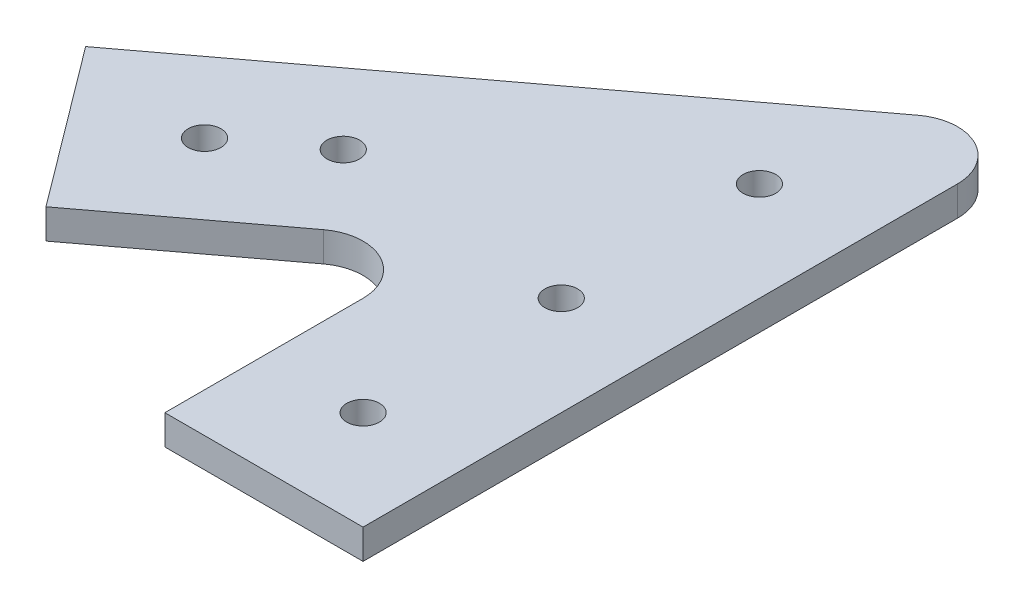
ISO-10303-21;
HEADER;
FILE_DESCRIPTION(('STEP AP214'),'2;1');
FILE_NAME('part.step','',(''),(''),'','','');
FILE_SCHEMA(('AUTOMOTIVE_DESIGN { 1 0 10303 214 1 1 1 1 }'));
ENDSEC;
DATA;
#1=APPLICATION_CONTEXT('core data for automotive mechanical design processes');
#2=APPLICATION_PROTOCOL_DEFINITION('international standard','automotive_design',2000,#1);
#3=PRODUCT_CONTEXT('',#1,'mechanical');
#4=PRODUCT('Part','Part','',(#3));
#5=PRODUCT_RELATED_PRODUCT_CATEGORY('part','',(#4));
#6=PRODUCT_DEFINITION_FORMATION('','',#4);
#7=PRODUCT_DEFINITION_CONTEXT('part definition',#1,'design');
#8=PRODUCT_DEFINITION('design','',#6,#7);
#9=PRODUCT_DEFINITION_SHAPE('','',#8);
#10=(LENGTH_UNIT() NAMED_UNIT(*) SI_UNIT(.MILLI.,.METRE.));
#11=(NAMED_UNIT(*) PLANE_ANGLE_UNIT() SI_UNIT($,.RADIAN.));
#12=(NAMED_UNIT(*) SI_UNIT($,.STERADIAN.) SOLID_ANGLE_UNIT());
#13=UNCERTAINTY_MEASURE_WITH_UNIT(LENGTH_MEASURE(1.E-05),#10,'distance_accuracy_value','');
#14=(GEOMETRIC_REPRESENTATION_CONTEXT(3) GLOBAL_UNCERTAINTY_ASSIGNED_CONTEXT((#13)) GLOBAL_UNIT_ASSIGNED_CONTEXT((#10,
#11,#12)) REPRESENTATION_CONTEXT('',''));
#15=CARTESIAN_POINT('',(0.,0.,0.));
#16=DIRECTION('',(0.,0.,1.));
#17=DIRECTION('',(1.,0.,0.));
#18=AXIS2_PLACEMENT_3D('',#15,#16,#17);
#19=CARTESIAN_POINT('',(0.,3.,0.));
#20=DIRECTION('',(0.,-1.,0.));
#21=DIRECTION('',(0.,0.,-1.));
#22=AXIS2_PLACEMENT_3D('',#19,#20,#21);
#23=PLANE('',#22);
#24=DIRECTION('',(6.39395257904201E-06,0.,-0.999999999979559));
#25=VECTOR('',#24,1.);
#26=CARTESIAN_POINT('',(27.6644898553289,3.,-35.3329838450773));
#27=LINE('',#26,#25);
#28=CARTESIAN_POINT('',(27.6640422930274,3.,34.6647672955904));
#29=VERTEX_POINT('',#28);
#30=CARTESIAN_POINT('',(27.6644259152837,3.,-25.3329026178744));
#31=VERTEX_POINT('',#30);
#32=EDGE_CURVE('E125',#29,#31,#27,.T.);
#33=ORIENTED_EDGE('',*,*,#32,.T.);
#34=CARTESIAN_POINT('',(22.6644259153859,3.,-25.3329345876373));
#35=DIRECTION('',(0.,-1.,0.));
#36=DIRECTION('',(0.,0.,-1.));
#37=AXIS2_PLACEMENT_3D('',#34,#35,#36);
#38=CIRCLE('',#37,5.);
#39=CARTESIAN_POINT('',(19.6644254985948,3.,-29.332934275044));
#40=VERTEX_POINT('',#39);
#41=EDGE_CURVE('E11',#31,#40,#38,.F.);
#42=ORIENTED_EDGE('',*,*,#41,.T.);
#43=DIRECTION('',(-0.79999993748133,0.,0.600000083358218));
#44=VECTOR('',#43,1.);
#45=CARTESIAN_POINT('',(-4.3327082499629,3.,-11.3350800566754));
#46=LINE('',#45,#44);
#47=CARTESIAN_POINT('',(-28.3327064048156,3.,6.66492246688072));
#48=VERTEX_POINT('',#47);
#49=EDGE_CURVE('E153',#40,#48,#46,.T.);
#50=ORIENTED_EDGE('',*,*,#49,.T.);
#51=DIRECTION('',(0.600000083358218,0.,0.79999993748133));
#52=VECTOR('',#51,1.);
#53=CARTESIAN_POINT('',(-28.3327064048156,3.,6.66492246688072));
#54=LINE('',#53,#52);
#55=CARTESIAN_POINT('',(-16.3327047547583,3.,22.6649211936978));
#56=VERTEX_POINT('',#55);
#57=EDGE_CURVE('E177',#48,#56,#54,.T.);
#58=ORIENTED_EDGE('',*,*,#57,.T.);
#59=DIRECTION('',(0.79999993748133,0.,-0.600000083358218));
#60=VECTOR('',#59,1.);
#61=CARTESIAN_POINT('',(-16.3327047547583,3.,22.6649211936978));
#62=LINE('',#61,#60);
#63=CARTESIAN_POINT('',(-0.333790882797412,3.,10.6657331849593));
#64=VERTEX_POINT('',#63);
#65=EDGE_CURVE('E172',#56,#64,#62,.T.);
#66=ORIENTED_EDGE('',*,*,#65,.T.);
#67=CARTESIAN_POINT('',(2.66620953399368,3.,14.665732872366));
#68=DIRECTION('',(0.,-1.,0.));
#69=DIRECTION('',(0.,0.,-1.));
#70=AXIS2_PLACEMENT_3D('',#67,#68,#69);
#71=CIRCLE('',#70,5.);
#72=CARTESIAN_POINT('',(7.6662095046342,3.,14.666274716206));
#73=VERTEX_POINT('',#72);
#74=EDGE_CURVE('E112',#64,#73,#71,.T.);
#75=ORIENTED_EDGE('',*,*,#74,.T.);
#76=DIRECTION('',(-0.000108368768007921,0.,0.999999994128105));
#77=VECTOR('',#76,1.);
#78=CARTESIAN_POINT('',(7.66404229261863,3.,34.6647672955904));
#79=LINE('',#78,#77);
#80=CARTESIAN_POINT('',(7.66404229261863,3.,34.6647672955904));
#81=VERTEX_POINT('',#80);
#82=EDGE_CURVE('E105',#73,#81,#79,.T.);
#83=ORIENTED_EDGE('',*,*,#82,.T.);
#84=DIRECTION('',(1.,0.,0.));
#85=VECTOR('',#84,1.);
#86=CARTESIAN_POINT('',(7.66404229261863,3.,34.6647672955904));
#87=LINE('',#86,#85);
#88=EDGE_CURVE('E108',#81,#29,#87,.T.);
#89=ORIENTED_EDGE('',*,*,#88,.T.);
#90=EDGE_LOOP('',(#33,#42,#50,#58,#66,#75,#83,#89));
#91=FACE_BOUND('',#90,.T.);
#92=CARTESIAN_POINT('',(17.6674917477853,3.,-15.3352327044096));
#93=DIRECTION('',(0.,1.,0.));
#94=DIRECTION('',(0.,0.,1.));
#95=AXIS2_PLACEMENT_3D('',#92,#93,#94);
#96=CIRCLE('',#95,1.64999999221491);
#97=CARTESIAN_POINT('',(17.6674917477853,3.,-13.6852327121947));
#98=VERTEX_POINT('',#97);
#99=EDGE_CURVE('E184',#98,#98,#96,.T.);
#100=ORIENTED_EDGE('',*,*,#99,.F.);
#101=EDGE_LOOP('',(#100));
#102=FACE_BOUND('',#101,.T.);
#103=CARTESIAN_POINT('',(-6.33270682787423,3.,2.66492016617309));
#104=DIRECTION('',(0.,1.,0.));
#105=DIRECTION('',(0.,0.,1.));
#106=AXIS2_PLACEMENT_3D('',#103,#104,#105);
#107=CIRCLE('',#106,1.64999999870472);
#108=CARTESIAN_POINT('',(-6.33270682787423,3.,4.31492016487781));
#109=VERTEX_POINT('',#108);
#110=EDGE_CURVE('E190',#109,#109,#107,.T.);
#111=ORIENTED_EDGE('',*,*,#110,.F.);
#112=EDGE_LOOP('',(#111));
#113=FACE_BOUND('',#112,.T.);
#114=CARTESIAN_POINT('',(17.6674917477848,3.,4.6647672955904));
#115=DIRECTION('',(0.,1.,0.));
#116=DIRECTION('',(0.,0.,1.));
#117=AXIS2_PLACEMENT_3D('',#114,#115,#116);
#118=CIRCLE('',#117,1.64999999221531);
#119=CARTESIAN_POINT('',(17.6674917477848,3.,6.31476728780571));
#120=VERTEX_POINT('',#119);
#121=EDGE_CURVE('E196',#120,#120,#118,.T.);
#122=ORIENTED_EDGE('',*,*,#121,.F.);
#123=EDGE_LOOP('',(#122));
#124=FACE_BOUND('',#123,.T.);
#125=CARTESIAN_POINT('',(17.667491747785,3.,24.6647672955904));
#126=DIRECTION('',(0.,1.,0.));
#127=DIRECTION('',(0.,0.,1.));
#128=AXIS2_PLACEMENT_3D('',#125,#126,#127);
#129=CIRCLE('',#128,1.64999999221489);
#130=CARTESIAN_POINT('',(17.667491747785,3.,26.3147672878053));
#131=VERTEX_POINT('',#130);
#132=EDGE_CURVE('E202',#131,#131,#129,.T.);
#133=ORIENTED_EDGE('',*,*,#132,.F.);
#134=EDGE_LOOP('',(#133));
#135=FACE_BOUND('',#134,.T.);
#136=CARTESIAN_POINT('',(-14.3327062049736,3.,8.66492099670696));
#137=DIRECTION('',(0.,1.,0.));
#138=DIRECTION('',(0.,0.,1.));
#139=AXIS2_PLACEMENT_3D('',#136,#137,#138);
#140=CIRCLE('',#139,1.6499999999998);
#141=CARTESIAN_POINT('',(-14.3327062049736,3.,10.3149209967068));
#142=VERTEX_POINT('',#141);
#143=EDGE_CURVE('E208',#142,#142,#140,.T.);
#144=ORIENTED_EDGE('',*,*,#143,.F.);
#145=EDGE_LOOP('',(#144));
#146=FACE_BOUND('',#145,.T.);
#147=ADVANCED_FACE('F41',(#91,#102,#113,#124,#135,#146),#23,.F.);
#148=CARTESIAN_POINT('',(0.,0.,0.));
#149=DIRECTION('',(0.,-1.,0.));
#150=DIRECTION('',(0.,0.,-1.));
#151=AXIS2_PLACEMENT_3D('',#148,#149,#150);
#152=PLANE('',#151);
#153=CARTESIAN_POINT('',(17.667491747785,0.,24.6647672955904));
#154=DIRECTION('',(0.,1.,0.));
#155=DIRECTION('',(0.,0.,1.));
#156=AXIS2_PLACEMENT_3D('',#153,#154,#155);
#157=CIRCLE('',#156,1.64999999221489);
#158=CARTESIAN_POINT('',(17.667491747785,0.,26.3147672878053));
#159=VERTEX_POINT('',#158);
#160=EDGE_CURVE('E205',#159,#159,#157,.T.);
#161=ORIENTED_EDGE('',*,*,#160,.T.);
#162=EDGE_LOOP('',(#161));
#163=FACE_BOUND('',#162,.T.);
#164=CARTESIAN_POINT('',(-6.33270682787423,0.,2.66492016617309));
#165=DIRECTION('',(0.,1.,0.));
#166=DIRECTION('',(0.,0.,1.));
#167=AXIS2_PLACEMENT_3D('',#164,#165,#166);
#168=CIRCLE('',#167,1.64999999870472);
#169=CARTESIAN_POINT('',(-6.33270682787423,0.,4.31492016487781));
#170=VERTEX_POINT('',#169);
#171=EDGE_CURVE('E193',#170,#170,#168,.T.);
#172=ORIENTED_EDGE('',*,*,#171,.T.);
#173=EDGE_LOOP('',(#172));
#174=FACE_BOUND('',#173,.T.);
#175=DIRECTION('',(-0.79999993748133,0.,0.600000083358218));
#176=VECTOR('',#175,1.);
#177=CARTESIAN_POINT('',(-28.3327064048156,0.,6.66492246688072));
#178=LINE('',#177,#176);
#179=CARTESIAN_POINT('',(19.6644254985948,0.,-29.332934275044));
#180=VERTEX_POINT('',#179);
#181=CARTESIAN_POINT('',(-28.3327064048156,0.,6.66492246688072));
#182=VERTEX_POINT('',#181);
#183=EDGE_CURVE('E151',#180,#182,#178,.T.);
#184=ORIENTED_EDGE('',*,*,#183,.F.);
#185=CARTESIAN_POINT('',(22.6644259153859,0.,-25.3329345876373));
#186=DIRECTION('',(0.,-1.,0.));
#187=DIRECTION('',(0.,0.,-1.));
#188=AXIS2_PLACEMENT_3D('',#185,#186,#187);
#189=CIRCLE('',#188,5.);
#190=CARTESIAN_POINT('',(27.6644259152837,0.,-25.3329026178744));
#191=VERTEX_POINT('',#190);
#192=EDGE_CURVE('E63',#180,#191,#189,.T.);
#193=ORIENTED_EDGE('',*,*,#192,.T.);
#194=DIRECTION('',(6.39395257904201E-06,0.,-0.999999999979559));
#195=VECTOR('',#194,1.);
#196=CARTESIAN_POINT('',(27.6644898553289,0.,-35.3329838450773));
#197=LINE('',#196,#195);
#198=CARTESIAN_POINT('',(27.6640422930274,0.,34.6647672955904));
#199=VERTEX_POINT('',#198);
#200=EDGE_CURVE('E161',#199,#191,#197,.T.);
#201=ORIENTED_EDGE('',*,*,#200,.F.);
#202=DIRECTION('',(1.,0.,0.));
#203=VECTOR('',#202,1.);
#204=CARTESIAN_POINT('',(7.66404229261863,0.,34.6647672955904));
#205=LINE('',#204,#203);
#206=CARTESIAN_POINT('',(7.66404229261863,0.,34.6647672955904));
#207=VERTEX_POINT('',#206);
#208=EDGE_CURVE('E164',#207,#199,#205,.T.);
#209=ORIENTED_EDGE('',*,*,#208,.F.);
#210=DIRECTION('',(-0.000108368768007921,0.,0.999999994128105));
#211=VECTOR('',#210,1.);
#212=CARTESIAN_POINT('',(7.66404229261863,0.,34.6647672955904));
#213=LINE('',#212,#211);
#214=CARTESIAN_POINT('',(7.6662095046342,0.,14.666274716206));
#215=VERTEX_POINT('',#214);
#216=EDGE_CURVE('E129',#215,#207,#213,.T.);
#217=ORIENTED_EDGE('',*,*,#216,.F.);
#218=CARTESIAN_POINT('',(2.66620953399368,0.,14.665732872366));
#219=DIRECTION('',(0.,-1.,0.));
#220=DIRECTION('',(0.,0.,-1.));
#221=AXIS2_PLACEMENT_3D('',#218,#219,#220);
#222=CIRCLE('',#221,5.);
#223=CARTESIAN_POINT('',(-0.333790882797412,0.,10.6657331849593));
#224=VERTEX_POINT('',#223);
#225=EDGE_CURVE('E140',#215,#224,#222,.F.);
#226=ORIENTED_EDGE('',*,*,#225,.T.);
#227=DIRECTION('',(0.79999993748133,0.,-0.600000083358218));
#228=VECTOR('',#227,1.);
#229=CARTESIAN_POINT('',(-16.3327047547583,0.,22.6649211936978));
#230=LINE('',#229,#228);
#231=CARTESIAN_POINT('',(-16.3327047547583,0.,22.6649211936978));
#232=VERTEX_POINT('',#231);
#233=EDGE_CURVE('E117',#232,#224,#230,.T.);
#234=ORIENTED_EDGE('',*,*,#233,.F.);
#235=DIRECTION('',(0.600000083358218,0.,0.79999993748133));
#236=VECTOR('',#235,1.);
#237=CARTESIAN_POINT('',(-28.3327064048156,0.,6.66492246688072));
#238=LINE('',#237,#236);
#239=EDGE_CURVE('E160',#182,#232,#238,.T.);
#240=ORIENTED_EDGE('',*,*,#239,.F.);
#241=EDGE_LOOP('',(#184,#193,#201,#209,#217,#226,#234,#240));
#242=FACE_BOUND('',#241,.T.);
#243=CARTESIAN_POINT('',(17.6674917477853,0.,-15.3352327044096));
#244=DIRECTION('',(0.,1.,0.));
#245=DIRECTION('',(0.,0.,1.));
#246=AXIS2_PLACEMENT_3D('',#243,#244,#245);
#247=CIRCLE('',#246,1.64999999221491);
#248=CARTESIAN_POINT('',(17.6674917477853,0.,-13.6852327121947));
#249=VERTEX_POINT('',#248);
#250=EDGE_CURVE('E187',#249,#249,#247,.T.);
#251=ORIENTED_EDGE('',*,*,#250,.T.);
#252=EDGE_LOOP('',(#251));
#253=FACE_BOUND('',#252,.T.);
#254=CARTESIAN_POINT('',(17.6674917477848,0.,4.6647672955904));
#255=DIRECTION('',(0.,1.,0.));
#256=DIRECTION('',(0.,0.,1.));
#257=AXIS2_PLACEMENT_3D('',#254,#255,#256);
#258=CIRCLE('',#257,1.64999999221531);
#259=CARTESIAN_POINT('',(17.6674917477848,0.,6.31476728780571));
#260=VERTEX_POINT('',#259);
#261=EDGE_CURVE('E199',#260,#260,#258,.T.);
#262=ORIENTED_EDGE('',*,*,#261,.T.);
#263=EDGE_LOOP('',(#262));
#264=FACE_BOUND('',#263,.T.);
#265=CARTESIAN_POINT('',(-14.3327062049736,0.,8.66492099670696));
#266=DIRECTION('',(0.,1.,0.));
#267=DIRECTION('',(0.,0.,1.));
#268=AXIS2_PLACEMENT_3D('',#265,#266,#267);
#269=CIRCLE('',#268,1.6499999999998);
#270=CARTESIAN_POINT('',(-14.3327062049736,0.,10.3149209967068));
#271=VERTEX_POINT('',#270);
#272=EDGE_CURVE('E211',#271,#271,#269,.T.);
#273=ORIENTED_EDGE('',*,*,#272,.T.);
#274=EDGE_LOOP('',(#273));
#275=FACE_BOUND('',#274,.T.);
#276=ADVANCED_FACE('F157',(#163,#174,#242,#253,#264,#275),#152,.T.);
#277=CARTESIAN_POINT('',(7.66404229261863,3.,34.6647672955904));
#278=DIRECTION('',(0.999999994128105,0.,0.000108368768007921));
#279=DIRECTION('',(0.000108368768007921,0.,-0.999999994128105));
#280=AXIS2_PLACEMENT_3D('',#277,#278,#279);
#281=PLANE('',#280);
#282=ORIENTED_EDGE('',*,*,#82,.F.);
#283=DIRECTION('',(0.,-1.,0.));
#284=VECTOR('',#283,1.);
#285=CARTESIAN_POINT('',(7.6662095046342,0.,14.666274716206));
#286=LINE('',#285,#284);
#287=EDGE_CURVE('E131',#73,#215,#286,.T.);
#288=ORIENTED_EDGE('',*,*,#287,.T.);
#289=ORIENTED_EDGE('',*,*,#216,.T.);
#290=DIRECTION('',(0.,-1.,0.));
#291=VECTOR('',#290,1.);
#292=CARTESIAN_POINT('',(7.66404229261863,3.,34.6647672955904));
#293=LINE('',#292,#291);
#294=EDGE_CURVE('E122',#81,#207,#293,.T.);
#295=ORIENTED_EDGE('',*,*,#294,.F.);
#296=EDGE_LOOP('',(#282,#288,#289,#295));
#297=FACE_BOUND('',#296,.T.);
#298=ADVANCED_FACE('F127',(#297),#281,.F.);
#299=CARTESIAN_POINT('',(7.66404229261863,3.,34.6647672955904));
#300=DIRECTION('',(0.,0.,-1.));
#301=DIRECTION('',(-1.,0.,0.));
#302=AXIS2_PLACEMENT_3D('',#299,#300,#301);
#303=PLANE('',#302);
#304=ORIENTED_EDGE('',*,*,#208,.T.);
#305=DIRECTION('',(0.,-1.,0.));
#306=VECTOR('',#305,1.);
#307=CARTESIAN_POINT('',(27.6640422930274,3.,34.6647672955904));
#308=LINE('',#307,#306);
#309=EDGE_CURVE('E124',#29,#199,#308,.T.);
#310=ORIENTED_EDGE('',*,*,#309,.F.);
#311=ORIENTED_EDGE('',*,*,#88,.F.);
#312=ORIENTED_EDGE('',*,*,#294,.T.);
#313=EDGE_LOOP('',(#304,#310,#311,#312));
#314=FACE_BOUND('',#313,.T.);
#315=ADVANCED_FACE('F121',(#314),#303,.F.);
#316=CARTESIAN_POINT('',(27.6644898553289,3.,-35.3329838450773));
#317=DIRECTION('',(-0.999999999979559,0.,-6.393952579042E-06));
#318=DIRECTION('',(-6.39395257904201E-06,0.,0.999999999979559));
#319=AXIS2_PLACEMENT_3D('',#316,#317,#318);
#320=PLANE('',#319);
#321=ORIENTED_EDGE('',*,*,#200,.T.);
#322=DIRECTION('',(0.,-1.,0.));
#323=VECTOR('',#322,1.);
#324=CARTESIAN_POINT('',(27.6644259152837,3.,-25.3329026178744));
#325=LINE('',#324,#323);
#326=EDGE_CURVE('E49',#191,#31,#325,.F.);
#327=ORIENTED_EDGE('',*,*,#326,.T.);
#328=ORIENTED_EDGE('',*,*,#32,.F.);
#329=ORIENTED_EDGE('',*,*,#309,.T.);
#330=EDGE_LOOP('',(#321,#327,#328,#329));
#331=FACE_BOUND('',#330,.T.);
#332=ADVANCED_FACE('F185',(#331),#320,.F.);
#333=CARTESIAN_POINT('',(-28.3327064048156,3.,6.66492246688072));
#334=DIRECTION('',(0.600000083358218,0.,0.79999993748133));
#335=DIRECTION('',(0.79999993748133,0.,-0.600000083358218));
#336=AXIS2_PLACEMENT_3D('',#333,#334,#335);
#337=PLANE('',#336);
#338=ORIENTED_EDGE('',*,*,#49,.F.);
#339=DIRECTION('',(0.,-1.,0.));
#340=VECTOR('',#339,1.);
#341=CARTESIAN_POINT('',(19.6644254985949,3.,-29.332934275044));
#342=LINE('',#341,#340);
#343=EDGE_CURVE('E143',#40,#180,#342,.T.);
#344=ORIENTED_EDGE('',*,*,#343,.T.);
#345=ORIENTED_EDGE('',*,*,#183,.T.);
#346=DIRECTION('',(0.,-1.,0.));
#347=VECTOR('',#346,1.);
#348=CARTESIAN_POINT('',(-28.3327064048156,3.,6.66492246688072));
#349=LINE('',#348,#347);
#350=EDGE_CURVE('E135',#48,#182,#349,.T.);
#351=ORIENTED_EDGE('',*,*,#350,.F.);
#352=EDGE_LOOP('',(#338,#344,#345,#351));
#353=FACE_BOUND('',#352,.T.);
#354=ADVANCED_FACE('F149',(#353),#337,.F.);
#355=CARTESIAN_POINT('',(-28.3327064048156,3.,6.66492246688072));
#356=DIRECTION('',(0.79999993748133,0.,-0.600000083358218));
#357=DIRECTION('',(-0.600000083358218,0.,-0.79999993748133));
#358=AXIS2_PLACEMENT_3D('',#355,#356,#357);
#359=PLANE('',#358);
#360=ORIENTED_EDGE('',*,*,#239,.T.);
#361=DIRECTION('',(0.,-1.,0.));
#362=VECTOR('',#361,1.);
#363=CARTESIAN_POINT('',(-16.3327047547583,3.,22.6649211936978));
#364=LINE('',#363,#362);
#365=EDGE_CURVE('E170',#56,#232,#364,.T.);
#366=ORIENTED_EDGE('',*,*,#365,.F.);
#367=ORIENTED_EDGE('',*,*,#57,.F.);
#368=ORIENTED_EDGE('',*,*,#350,.T.);
#369=EDGE_LOOP('',(#360,#366,#367,#368));
#370=FACE_BOUND('',#369,.T.);
#371=ADVANCED_FACE('F175',(#370),#359,.F.);
#372=CARTESIAN_POINT('',(-16.3327047547583,3.,22.6649211936978));
#373=DIRECTION('',(-0.600000083358218,0.,-0.79999993748133));
#374=DIRECTION('',(-0.79999993748133,0.,0.600000083358218));
#375=AXIS2_PLACEMENT_3D('',#372,#373,#374);
#376=PLANE('',#375);
#377=ORIENTED_EDGE('',*,*,#233,.T.);
#378=DIRECTION('',(0.,-1.,0.));
#379=VECTOR('',#378,1.);
#380=CARTESIAN_POINT('',(-0.333790882797411,3.,10.6657331849593));
#381=LINE('',#380,#379);
#382=EDGE_CURVE('E133',#224,#64,#381,.F.);
#383=ORIENTED_EDGE('',*,*,#382,.T.);
#384=ORIENTED_EDGE('',*,*,#65,.F.);
#385=ORIENTED_EDGE('',*,*,#365,.T.);
#386=EDGE_LOOP('',(#377,#383,#384,#385));
#387=FACE_BOUND('',#386,.T.);
#388=ADVANCED_FACE('F232',(#387),#376,.F.);
#389=CARTESIAN_POINT('',(17.6674917477853,3.,-15.3352327044096));
#390=DIRECTION('',(0.,-1.,0.));
#391=DIRECTION('',(0.,0.,-1.));
#392=AXIS2_PLACEMENT_3D('',#389,#390,#391);
#393=CYLINDRICAL_SURFACE('',#392,1.64999999221491);
#394=ORIENTED_EDGE('',*,*,#99,.T.);
#395=EDGE_LOOP('',(#394));
#396=FACE_BOUND('',#395,.T.);
#397=ORIENTED_EDGE('',*,*,#250,.F.);
#398=EDGE_LOOP('',(#397));
#399=FACE_BOUND('',#398,.T.);
#400=ADVANCED_FACE('F229',(#396,#399),#393,.F.);
#401=CARTESIAN_POINT('',(-6.33270682787423,3.,2.66492016617309));
#402=DIRECTION('',(0.,-1.,0.));
#403=DIRECTION('',(0.,0.,-1.));
#404=AXIS2_PLACEMENT_3D('',#401,#402,#403);
#405=CYLINDRICAL_SURFACE('',#404,1.64999999870472);
#406=ORIENTED_EDGE('',*,*,#110,.T.);
#407=EDGE_LOOP('',(#406));
#408=FACE_BOUND('',#407,.T.);
#409=ORIENTED_EDGE('',*,*,#171,.F.);
#410=EDGE_LOOP('',(#409));
#411=FACE_BOUND('',#410,.T.);
#412=ADVANCED_FACE('F262',(#408,#411),#405,.F.);
#413=CARTESIAN_POINT('',(17.6674917477848,3.,4.6647672955904));
#414=DIRECTION('',(0.,-1.,0.));
#415=DIRECTION('',(0.,0.,-1.));
#416=AXIS2_PLACEMENT_3D('',#413,#414,#415);
#417=CYLINDRICAL_SURFACE('',#416,1.64999999221531);
#418=ORIENTED_EDGE('',*,*,#121,.T.);
#419=EDGE_LOOP('',(#418));
#420=FACE_BOUND('',#419,.T.);
#421=ORIENTED_EDGE('',*,*,#261,.F.);
#422=EDGE_LOOP('',(#421));
#423=FACE_BOUND('',#422,.T.);
#424=ADVANCED_FACE('F257',(#420,#423),#417,.F.);
#425=CARTESIAN_POINT('',(17.667491747785,3.,24.6647672955904));
#426=DIRECTION('',(0.,-1.,0.));
#427=DIRECTION('',(0.,0.,-1.));
#428=AXIS2_PLACEMENT_3D('',#425,#426,#427);
#429=CYLINDRICAL_SURFACE('',#428,1.64999999221489);
#430=ORIENTED_EDGE('',*,*,#132,.T.);
#431=EDGE_LOOP('',(#430));
#432=FACE_BOUND('',#431,.T.);
#433=ORIENTED_EDGE('',*,*,#160,.F.);
#434=EDGE_LOOP('',(#433));
#435=FACE_BOUND('',#434,.T.);
#436=ADVANCED_FACE('F251',(#432,#435),#429,.F.);
#437=CARTESIAN_POINT('',(-14.3327062049736,3.,8.66492099670696));
#438=DIRECTION('',(0.,-1.,0.));
#439=DIRECTION('',(0.,0.,-1.));
#440=AXIS2_PLACEMENT_3D('',#437,#438,#439);
#441=CYLINDRICAL_SURFACE('',#440,1.6499999999998);
#442=ORIENTED_EDGE('',*,*,#143,.T.);
#443=EDGE_LOOP('',(#442));
#444=FACE_BOUND('',#443,.T.);
#445=ORIENTED_EDGE('',*,*,#272,.F.);
#446=EDGE_LOOP('',(#445));
#447=FACE_BOUND('',#446,.T.);
#448=ADVANCED_FACE('F217',(#444,#447),#441,.F.);
#449=CARTESIAN_POINT('',(2.66620953399368,3.,14.665732872366));
#450=DIRECTION('',(0.,1.,0.));
#451=DIRECTION('',(0.,0.,1.));
#452=AXIS2_PLACEMENT_3D('',#449,#450,#451);
#453=CYLINDRICAL_SURFACE('',#452,5.);
#454=ORIENTED_EDGE('',*,*,#74,.F.);
#455=ORIENTED_EDGE('',*,*,#382,.F.);
#456=ORIENTED_EDGE('',*,*,#225,.F.);
#457=ORIENTED_EDGE('',*,*,#287,.F.);
#458=EDGE_LOOP('',(#454,#455,#456,#457));
#459=FACE_BOUND('',#458,.T.);
#460=ADVANCED_FACE('F245',(#459),#453,.F.);
#461=CARTESIAN_POINT('',(22.6644259153859,3.,-25.3329345876373));
#462=DIRECTION('',(0.,-1.,0.));
#463=DIRECTION('',(0.,0.,-1.));
#464=AXIS2_PLACEMENT_3D('',#461,#462,#463);
#465=CYLINDRICAL_SURFACE('',#464,5.);
#466=ORIENTED_EDGE('',*,*,#41,.F.);
#467=ORIENTED_EDGE('',*,*,#326,.F.);
#468=ORIENTED_EDGE('',*,*,#192,.F.);
#469=ORIENTED_EDGE('',*,*,#343,.F.);
#470=EDGE_LOOP('',(#466,#467,#468,#469));
#471=FACE_BOUND('',#470,.T.);
#472=ADVANCED_FACE('F43',(#471),#465,.T.);
#473=CLOSED_SHELL('',(#147,#276,#298,#315,#332,#354,#371,#388,#400,#412,#424,#436,#448,#460,#472));
#474=MANIFOLD_SOLID_BREP('B2',#473);
#475=ADVANCED_BREP_SHAPE_REPRESENTATION('',(#18,#474),#14);
#476=SHAPE_DEFINITION_REPRESENTATION(#9,#475);
ENDSEC;
END-ISO-10303-21;
